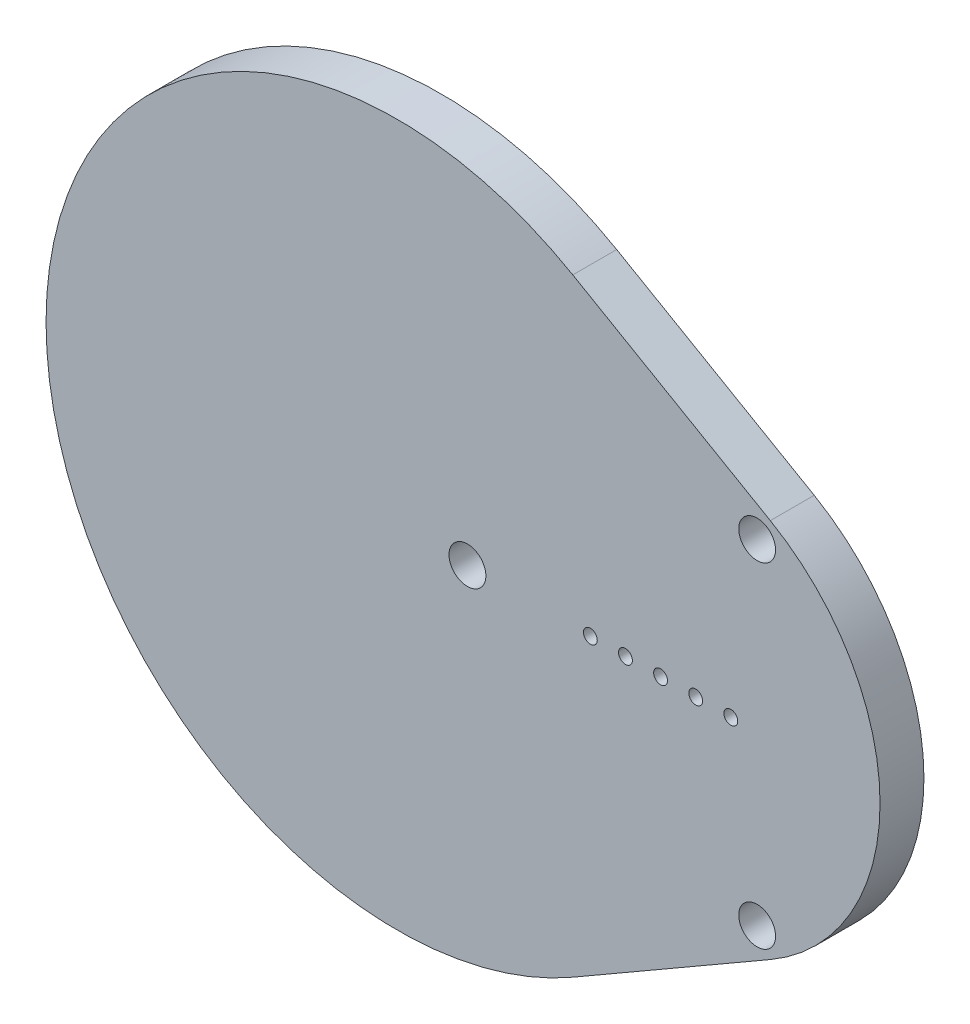
ISO-10303-21;
HEADER;
FILE_DESCRIPTION(('STEP AP214'),'2;1');
FILE_NAME('part.step','',(''),(''),'','','');
FILE_SCHEMA(('AUTOMOTIVE_DESIGN { 1 0 10303 214 1 1 1 1 }'));
ENDSEC;
DATA;
#1=APPLICATION_CONTEXT('core data for automotive mechanical design processes');
#2=APPLICATION_PROTOCOL_DEFINITION('international standard','automotive_design',2000,#1);
#3=PRODUCT_CONTEXT('',#1,'mechanical');
#4=PRODUCT('Part','Part','',(#3));
#5=PRODUCT_RELATED_PRODUCT_CATEGORY('part','',(#4));
#6=PRODUCT_DEFINITION_FORMATION('','',#4);
#7=PRODUCT_DEFINITION_CONTEXT('part definition',#1,'design');
#8=PRODUCT_DEFINITION('design','',#6,#7);
#9=PRODUCT_DEFINITION_SHAPE('','',#8);
#10=(LENGTH_UNIT() NAMED_UNIT(*) SI_UNIT(.MILLI.,.METRE.));
#11=(NAMED_UNIT(*) PLANE_ANGLE_UNIT() SI_UNIT($,.RADIAN.));
#12=(NAMED_UNIT(*) SI_UNIT($,.STERADIAN.) SOLID_ANGLE_UNIT());
#13=UNCERTAINTY_MEASURE_WITH_UNIT(LENGTH_MEASURE(1.E-05),#10,'distance_accuracy_value','');
#14=(GEOMETRIC_REPRESENTATION_CONTEXT(3) GLOBAL_UNCERTAINTY_ASSIGNED_CONTEXT((#13)) GLOBAL_UNIT_ASSIGNED_CONTEXT((#10,
#11,#12)) REPRESENTATION_CONTEXT('',''));
#15=CARTESIAN_POINT('',(0.,0.,0.));
#16=DIRECTION('',(0.,0.,1.));
#17=DIRECTION('',(1.,0.,0.));
#18=AXIS2_PLACEMENT_3D('',#15,#16,#17);
#19=CARTESIAN_POINT('',(15.875,27.4963065701559,6.35));
#20=DIRECTION('',(-0.5,-0.866025403784439,0.));
#21=DIRECTION('',(0.866025403784439,-0.5,0.));
#22=AXIS2_PLACEMENT_3D('',#19,#20,#21);
#23=PLANE('',#22);
#24=DIRECTION('',(-0.866025403784439,0.5,0.));
#25=VECTOR('',#24,1.);
#26=CARTESIAN_POINT('',(15.875,27.4963065701559,0.));
#27=LINE('',#26,#25);
#28=CARTESIAN_POINT('',(15.875,27.4963065701559,0.));
#29=VERTEX_POINT('',#28);
#30=CARTESIAN_POINT('',(-12.7,43.9940905122495,0.));
#31=VERTEX_POINT('',#30);
#32=EDGE_CURVE('E290',#29,#31,#27,.T.);
#33=ORIENTED_EDGE('',*,*,#32,.T.);
#34=DIRECTION('',(0.,0.,-1.));
#35=VECTOR('',#34,1.);
#36=CARTESIAN_POINT('',(-12.7,43.9940905122495,6.35));
#37=LINE('',#36,#35);
#38=CARTESIAN_POINT('',(-12.7,43.9940905122495,6.35));
#39=VERTEX_POINT('',#38);
#40=EDGE_CURVE('E235',#39,#31,#37,.T.);
#41=ORIENTED_EDGE('',*,*,#40,.F.);
#42=DIRECTION('',(-0.866025403784439,0.5,0.));
#43=VECTOR('',#42,1.);
#44=CARTESIAN_POINT('',(15.875,27.4963065701559,6.35));
#45=LINE('',#44,#43);
#46=CARTESIAN_POINT('',(15.875,27.4963065701559,6.35));
#47=VERTEX_POINT('',#46);
#48=EDGE_CURVE('E276',#47,#39,#45,.T.);
#49=ORIENTED_EDGE('',*,*,#48,.F.);
#50=DIRECTION('',(0.,0.,-1.));
#51=VECTOR('',#50,1.);
#52=CARTESIAN_POINT('',(15.875,27.4963065701559,6.35));
#53=LINE('',#52,#51);
#54=EDGE_CURVE('E12',#47,#29,#53,.T.);
#55=ORIENTED_EDGE('',*,*,#54,.T.);
#56=EDGE_LOOP('',(#33,#41,#49,#55));
#57=FACE_BOUND('',#56,.T.);
#58=ADVANCED_FACE('F224',(#57),#23,.F.);
#59=CARTESIAN_POINT('',(-38.1,0.,6.35));
#60=DIRECTION('',(0.,0.,-1.));
#61=DIRECTION('',(-1.,0.,0.));
#62=AXIS2_PLACEMENT_3D('',#59,#60,#61);
#63=CYLINDRICAL_SURFACE('',#62,50.8);
#64=CARTESIAN_POINT('',(-38.1,0.,0.));
#65=DIRECTION('',(0.,0.,1.));
#66=DIRECTION('',(1.,0.,0.));
#67=AXIS2_PLACEMENT_3D('',#64,#65,#66);
#68=CIRCLE('',#67,50.8);
#69=CARTESIAN_POINT('',(-12.7,-43.9940905122495,0.));
#70=VERTEX_POINT('',#69);
#71=EDGE_CURVE('E306',#31,#70,#68,.T.);
#72=ORIENTED_EDGE('',*,*,#71,.T.);
#73=DIRECTION('',(0.,0.,-1.));
#74=VECTOR('',#73,1.);
#75=CARTESIAN_POINT('',(-12.7,-43.9940905122495,6.35));
#76=LINE('',#75,#74);
#77=CARTESIAN_POINT('',(-12.7,-43.9940905122495,6.35));
#78=VERTEX_POINT('',#77);
#79=EDGE_CURVE('E262',#78,#70,#76,.T.);
#80=ORIENTED_EDGE('',*,*,#79,.F.);
#81=CARTESIAN_POINT('',(-38.1,0.,6.35));
#82=DIRECTION('',(0.,0.,1.));
#83=DIRECTION('',(1.,0.,0.));
#84=AXIS2_PLACEMENT_3D('',#81,#82,#83);
#85=CIRCLE('',#84,50.8);
#86=EDGE_CURVE('E282',#39,#78,#85,.T.);
#87=ORIENTED_EDGE('',*,*,#86,.F.);
#88=ORIENTED_EDGE('',*,*,#40,.T.);
#89=EDGE_LOOP('',(#72,#80,#87,#88));
#90=FACE_BOUND('',#89,.T.);
#91=ADVANCED_FACE('F295',(#90),#63,.T.);
#92=CARTESIAN_POINT('',(15.875,-27.4963065701559,6.35));
#93=DIRECTION('',(0.5,-0.866025403784439,0.));
#94=DIRECTION('',(0.866025403784439,0.5,0.));
#95=AXIS2_PLACEMENT_3D('',#92,#93,#94);
#96=PLANE('',#95);
#97=DIRECTION('',(-0.866025403784439,-0.5,0.));
#98=VECTOR('',#97,1.);
#99=CARTESIAN_POINT('',(15.875,-27.4963065701559,0.));
#100=LINE('',#99,#98);
#101=CARTESIAN_POINT('',(15.875,-27.4963065701559,0.));
#102=VERTEX_POINT('',#101);
#103=EDGE_CURVE('E286',#102,#70,#100,.T.);
#104=ORIENTED_EDGE('',*,*,#103,.F.);
#105=DIRECTION('',(0.,0.,-1.));
#106=VECTOR('',#105,1.);
#107=CARTESIAN_POINT('',(15.875,-27.4963065701559,6.35));
#108=LINE('',#107,#106);
#109=CARTESIAN_POINT('',(15.875,-27.4963065701559,6.35));
#110=VERTEX_POINT('',#109);
#111=EDGE_CURVE('E246',#110,#102,#108,.T.);
#112=ORIENTED_EDGE('',*,*,#111,.F.);
#113=DIRECTION('',(-0.866025403784439,-0.5,0.));
#114=VECTOR('',#113,1.);
#115=CARTESIAN_POINT('',(15.875,-27.4963065701559,6.35));
#116=LINE('',#115,#114);
#117=EDGE_CURVE('E297',#110,#78,#116,.T.);
#118=ORIENTED_EDGE('',*,*,#117,.T.);
#119=ORIENTED_EDGE('',*,*,#79,.T.);
#120=EDGE_LOOP('',(#104,#112,#118,#119));
#121=FACE_BOUND('',#120,.T.);
#122=ADVANCED_FACE('F379',(#121),#96,.T.);
#123=CARTESIAN_POINT('',(0.,0.,0.));
#124=DIRECTION('',(0.,0.,1.));
#125=DIRECTION('',(1.,0.,0.));
#126=AXIS2_PLACEMENT_3D('',#123,#124,#125);
#127=PLANE('',#126);
#128=ORIENTED_EDGE('',*,*,#32,.F.);
#129=CARTESIAN_POINT('',(0.,0.,0.));
#130=DIRECTION('',(0.,0.,1.));
#131=DIRECTION('',(1.,0.,0.));
#132=AXIS2_PLACEMENT_3D('',#129,#130,#131);
#133=CIRCLE('',#132,31.75);
#134=EDGE_CURVE('E228',#102,#29,#133,.T.);
#135=ORIENTED_EDGE('',*,*,#134,.F.);
#136=ORIENTED_EDGE('',*,*,#103,.T.);
#137=ORIENTED_EDGE('',*,*,#71,.F.);
#138=EDGE_LOOP('',(#128,#135,#136,#137));
#139=FACE_BOUND('',#138,.T.);
#140=CARTESIAN_POINT('',(13.97,24.1967497817372,0.));
#141=DIRECTION('',(0.,0.,1.));
#142=DIRECTION('',(1.,0.,0.));
#143=AXIS2_PLACEMENT_3D('',#140,#141,#142);
#144=CIRCLE('',#143,2.665);
#145=CARTESIAN_POINT('',(16.635,24.1967497817372,0.));
#146=VERTEX_POINT('',#145);
#147=EDGE_CURVE('E364',#146,#146,#144,.T.);
#148=ORIENTED_EDGE('',*,*,#147,.T.);
#149=EDGE_LOOP('',(#148));
#150=FACE_BOUND('',#149,.T.);
#151=CARTESIAN_POINT('',(13.97,-24.1967497817372,0.));
#152=DIRECTION('',(0.,0.,1.));
#153=DIRECTION('',(1.,0.,0.));
#154=AXIS2_PLACEMENT_3D('',#151,#152,#153);
#155=CIRCLE('',#154,2.66500000000001);
#156=CARTESIAN_POINT('',(16.635,-24.1967497817372,0.));
#157=VERTEX_POINT('',#156);
#158=EDGE_CURVE('E357',#157,#157,#155,.T.);
#159=ORIENTED_EDGE('',*,*,#158,.T.);
#160=EDGE_LOOP('',(#159));
#161=FACE_BOUND('',#160,.T.);
#162=CARTESIAN_POINT('',(-27.94,0.,0.));
#163=DIRECTION('',(0.,0.,1.));
#164=DIRECTION('',(1.,0.,0.));
#165=AXIS2_PLACEMENT_3D('',#162,#163,#164);
#166=CIRCLE('',#165,2.665);
#167=CARTESIAN_POINT('',(-25.275,0.,0.));
#168=VERTEX_POINT('',#167);
#169=EDGE_CURVE('E350',#168,#168,#166,.T.);
#170=ORIENTED_EDGE('',*,*,#169,.T.);
#171=EDGE_LOOP('',(#170));
#172=FACE_BOUND('',#171,.T.);
#173=CARTESIAN_POINT('',(-10.16,0.,0.));
#174=DIRECTION('',(0.,0.,1.));
#175=DIRECTION('',(1.,0.,0.));
#176=AXIS2_PLACEMENT_3D('',#173,#174,#175);
#177=CIRCLE('',#176,1.);
#178=CARTESIAN_POINT('',(-9.16,0.,0.));
#179=VERTEX_POINT('',#178);
#180=EDGE_CURVE('E342',#179,#179,#177,.T.);
#181=ORIENTED_EDGE('',*,*,#180,.T.);
#182=EDGE_LOOP('',(#181));
#183=FACE_BOUND('',#182,.T.);
#184=CARTESIAN_POINT('',(0.,0.,0.));
#185=DIRECTION('',(0.,0.,1.));
#186=DIRECTION('',(1.,0.,0.));
#187=AXIS2_PLACEMENT_3D('',#184,#185,#186);
#188=CIRCLE('',#187,1.);
#189=CARTESIAN_POINT('',(1.,0.,0.));
#190=VERTEX_POINT('',#189);
#191=EDGE_CURVE('E334',#190,#190,#188,.T.);
#192=ORIENTED_EDGE('',*,*,#191,.T.);
#193=EDGE_LOOP('',(#192));
#194=FACE_BOUND('',#193,.T.);
#195=CARTESIAN_POINT('',(5.08,0.,0.));
#196=DIRECTION('',(0.,0.,1.));
#197=DIRECTION('',(1.,0.,0.));
#198=AXIS2_PLACEMENT_3D('',#195,#196,#197);
#199=CIRCLE('',#198,1.);
#200=CARTESIAN_POINT('',(6.08,0.,0.));
#201=VERTEX_POINT('',#200);
#202=EDGE_CURVE('E327',#201,#201,#199,.T.);
#203=ORIENTED_EDGE('',*,*,#202,.T.);
#204=EDGE_LOOP('',(#203));
#205=FACE_BOUND('',#204,.T.);
#206=CARTESIAN_POINT('',(10.16,0.,0.));
#207=DIRECTION('',(0.,0.,1.));
#208=DIRECTION('',(1.,0.,0.));
#209=AXIS2_PLACEMENT_3D('',#206,#207,#208);
#210=CIRCLE('',#209,1.);
#211=CARTESIAN_POINT('',(11.16,0.,0.));
#212=VERTEX_POINT('',#211);
#213=EDGE_CURVE('E318',#212,#212,#210,.T.);
#214=ORIENTED_EDGE('',*,*,#213,.T.);
#215=EDGE_LOOP('',(#214));
#216=FACE_BOUND('',#215,.T.);
#217=CARTESIAN_POINT('',(-5.08,0.,0.));
#218=DIRECTION('',(0.,0.,1.));
#219=DIRECTION('',(1.,0.,0.));
#220=AXIS2_PLACEMENT_3D('',#217,#218,#219);
#221=CIRCLE('',#220,1.);
#222=CARTESIAN_POINT('',(-4.08,0.,0.));
#223=VERTEX_POINT('',#222);
#224=EDGE_CURVE('E319',#223,#223,#221,.T.);
#225=ORIENTED_EDGE('',*,*,#224,.T.);
#226=EDGE_LOOP('',(#225));
#227=FACE_BOUND('',#226,.T.);
#228=ADVANCED_FACE('F377',(#139,#150,#161,#172,#183,#194,#205,#216,#227),#127,.F.);
#229=CARTESIAN_POINT('',(0.,0.,6.35));
#230=DIRECTION('',(0.,0.,1.));
#231=DIRECTION('',(1.,0.,0.));
#232=AXIS2_PLACEMENT_3D('',#229,#230,#231);
#233=PLANE('',#232);
#234=ORIENTED_EDGE('',*,*,#117,.F.);
#235=CARTESIAN_POINT('',(0.,0.,6.35));
#236=DIRECTION('',(0.,0.,1.));
#237=DIRECTION('',(1.,0.,0.));
#238=AXIS2_PLACEMENT_3D('',#235,#236,#237);
#239=CIRCLE('',#238,31.75);
#240=EDGE_CURVE('E283',#110,#47,#239,.T.);
#241=ORIENTED_EDGE('',*,*,#240,.T.);
#242=ORIENTED_EDGE('',*,*,#48,.T.);
#243=ORIENTED_EDGE('',*,*,#86,.T.);
#244=EDGE_LOOP('',(#234,#241,#242,#243));
#245=FACE_BOUND('',#244,.T.);
#246=CARTESIAN_POINT('',(10.16,0.,6.35));
#247=DIRECTION('',(0.,0.,1.));
#248=DIRECTION('',(1.,0.,0.));
#249=AXIS2_PLACEMENT_3D('',#246,#247,#248);
#250=CIRCLE('',#249,1.);
#251=CARTESIAN_POINT('',(11.16,0.,6.35));
#252=VERTEX_POINT('',#251);
#253=EDGE_CURVE('E323',#252,#252,#250,.T.);
#254=ORIENTED_EDGE('',*,*,#253,.F.);
#255=EDGE_LOOP('',(#254));
#256=FACE_BOUND('',#255,.T.);
#257=CARTESIAN_POINT('',(0.,0.,6.35));
#258=DIRECTION('',(0.,0.,1.));
#259=DIRECTION('',(1.,0.,0.));
#260=AXIS2_PLACEMENT_3D('',#257,#258,#259);
#261=CIRCLE('',#260,1.);
#262=CARTESIAN_POINT('',(1.,0.,6.35));
#263=VERTEX_POINT('',#262);
#264=EDGE_CURVE('E338',#263,#263,#261,.T.);
#265=ORIENTED_EDGE('',*,*,#264,.F.);
#266=EDGE_LOOP('',(#265));
#267=FACE_BOUND('',#266,.T.);
#268=CARTESIAN_POINT('',(-27.94,0.,6.35));
#269=DIRECTION('',(0.,0.,1.));
#270=DIRECTION('',(1.,0.,0.));
#271=AXIS2_PLACEMENT_3D('',#268,#269,#270);
#272=CIRCLE('',#271,2.665);
#273=CARTESIAN_POINT('',(-25.275,0.,6.35));
#274=VERTEX_POINT('',#273);
#275=EDGE_CURVE('E354',#274,#274,#272,.T.);
#276=ORIENTED_EDGE('',*,*,#275,.F.);
#277=EDGE_LOOP('',(#276));
#278=FACE_BOUND('',#277,.T.);
#279=CARTESIAN_POINT('',(13.97,24.1967497817372,6.35));
#280=DIRECTION('',(0.,0.,1.));
#281=DIRECTION('',(1.,0.,0.));
#282=AXIS2_PLACEMENT_3D('',#279,#280,#281);
#283=CIRCLE('',#282,2.665);
#284=CARTESIAN_POINT('',(16.635,24.1967497817372,6.35));
#285=VERTEX_POINT('',#284);
#286=EDGE_CURVE('E368',#285,#285,#283,.T.);
#287=ORIENTED_EDGE('',*,*,#286,.F.);
#288=EDGE_LOOP('',(#287));
#289=FACE_BOUND('',#288,.T.);
#290=CARTESIAN_POINT('',(13.97,-24.1967497817372,6.35));
#291=DIRECTION('',(0.,0.,1.));
#292=DIRECTION('',(1.,0.,0.));
#293=AXIS2_PLACEMENT_3D('',#290,#291,#292);
#294=CIRCLE('',#293,2.66500000000001);
#295=CARTESIAN_POINT('',(16.635,-24.1967497817372,6.35));
#296=VERTEX_POINT('',#295);
#297=EDGE_CURVE('E360',#296,#296,#294,.T.);
#298=ORIENTED_EDGE('',*,*,#297,.F.);
#299=EDGE_LOOP('',(#298));
#300=FACE_BOUND('',#299,.T.);
#301=CARTESIAN_POINT('',(-10.16,0.,6.35));
#302=DIRECTION('',(0.,0.,1.));
#303=DIRECTION('',(1.,0.,0.));
#304=AXIS2_PLACEMENT_3D('',#301,#302,#303);
#305=CIRCLE('',#304,1.);
#306=CARTESIAN_POINT('',(-9.16,0.,6.35));
#307=VERTEX_POINT('',#306);
#308=EDGE_CURVE('E346',#307,#307,#305,.T.);
#309=ORIENTED_EDGE('',*,*,#308,.F.);
#310=EDGE_LOOP('',(#309));
#311=FACE_BOUND('',#310,.T.);
#312=CARTESIAN_POINT('',(5.08,0.,6.35));
#313=DIRECTION('',(0.,0.,1.));
#314=DIRECTION('',(1.,0.,0.));
#315=AXIS2_PLACEMENT_3D('',#312,#313,#314);
#316=CIRCLE('',#315,1.);
#317=CARTESIAN_POINT('',(6.08,0.,6.35));
#318=VERTEX_POINT('',#317);
#319=EDGE_CURVE('E331',#318,#318,#316,.T.);
#320=ORIENTED_EDGE('',*,*,#319,.F.);
#321=EDGE_LOOP('',(#320));
#322=FACE_BOUND('',#321,.T.);
#323=CARTESIAN_POINT('',(-5.08,0.,6.35));
#324=DIRECTION('',(0.,0.,1.));
#325=DIRECTION('',(1.,0.,0.));
#326=AXIS2_PLACEMENT_3D('',#323,#324,#325);
#327=CIRCLE('',#326,1.);
#328=CARTESIAN_POINT('',(-4.08,0.,6.35));
#329=VERTEX_POINT('',#328);
#330=EDGE_CURVE('E314',#329,#329,#327,.T.);
#331=ORIENTED_EDGE('',*,*,#330,.F.);
#332=EDGE_LOOP('',(#331));
#333=FACE_BOUND('',#332,.T.);
#334=ADVANCED_FACE('F279',(#245,#256,#267,#278,#289,#300,#311,#322,#333),#233,.T.);
#335=CARTESIAN_POINT('',(-5.08,0.,6.35));
#336=DIRECTION('',(0.,0.,-1.));
#337=DIRECTION('',(-1.,0.,0.));
#338=AXIS2_PLACEMENT_3D('',#335,#336,#337);
#339=CYLINDRICAL_SURFACE('',#338,1.);
#340=ORIENTED_EDGE('',*,*,#330,.T.);
#341=EDGE_LOOP('',(#340));
#342=FACE_BOUND('',#341,.T.);
#343=ORIENTED_EDGE('',*,*,#224,.F.);
#344=EDGE_LOOP('',(#343));
#345=FACE_BOUND('',#344,.T.);
#346=ADVANCED_FACE('F393',(#342,#345),#339,.F.);
#347=CARTESIAN_POINT('',(10.16,0.,6.35));
#348=DIRECTION('',(0.,0.,-1.));
#349=DIRECTION('',(-1.,0.,0.));
#350=AXIS2_PLACEMENT_3D('',#347,#348,#349);
#351=CYLINDRICAL_SURFACE('',#350,1.);
#352=ORIENTED_EDGE('',*,*,#253,.T.);
#353=EDGE_LOOP('',(#352));
#354=FACE_BOUND('',#353,.T.);
#355=ORIENTED_EDGE('',*,*,#213,.F.);
#356=EDGE_LOOP('',(#355));
#357=FACE_BOUND('',#356,.T.);
#358=ADVANCED_FACE('F396',(#354,#357),#351,.F.);
#359=CARTESIAN_POINT('',(5.08,0.,6.35));
#360=DIRECTION('',(0.,0.,-1.));
#361=DIRECTION('',(-1.,0.,0.));
#362=AXIS2_PLACEMENT_3D('',#359,#360,#361);
#363=CYLINDRICAL_SURFACE('',#362,1.);
#364=ORIENTED_EDGE('',*,*,#319,.T.);
#365=EDGE_LOOP('',(#364));
#366=FACE_BOUND('',#365,.T.);
#367=ORIENTED_EDGE('',*,*,#202,.F.);
#368=EDGE_LOOP('',(#367));
#369=FACE_BOUND('',#368,.T.);
#370=ADVANCED_FACE('F400',(#366,#369),#363,.F.);
#371=CARTESIAN_POINT('',(0.,0.,6.35));
#372=DIRECTION('',(0.,0.,-1.));
#373=DIRECTION('',(-1.,0.,0.));
#374=AXIS2_PLACEMENT_3D('',#371,#372,#373);
#375=CYLINDRICAL_SURFACE('',#374,1.);
#376=ORIENTED_EDGE('',*,*,#264,.T.);
#377=EDGE_LOOP('',(#376));
#378=FACE_BOUND('',#377,.T.);
#379=ORIENTED_EDGE('',*,*,#191,.F.);
#380=EDGE_LOOP('',(#379));
#381=FACE_BOUND('',#380,.T.);
#382=ADVANCED_FACE('F404',(#378,#381),#375,.F.);
#383=CARTESIAN_POINT('',(-10.16,0.,6.35));
#384=DIRECTION('',(0.,0.,-1.));
#385=DIRECTION('',(-1.,0.,0.));
#386=AXIS2_PLACEMENT_3D('',#383,#384,#385);
#387=CYLINDRICAL_SURFACE('',#386,1.);
#388=ORIENTED_EDGE('',*,*,#308,.T.);
#389=EDGE_LOOP('',(#388));
#390=FACE_BOUND('',#389,.T.);
#391=ORIENTED_EDGE('',*,*,#180,.F.);
#392=EDGE_LOOP('',(#391));
#393=FACE_BOUND('',#392,.T.);
#394=ADVANCED_FACE('F408',(#390,#393),#387,.F.);
#395=CARTESIAN_POINT('',(-27.94,0.,6.35));
#396=DIRECTION('',(0.,0.,-1.));
#397=DIRECTION('',(-1.,0.,0.));
#398=AXIS2_PLACEMENT_3D('',#395,#396,#397);
#399=CYLINDRICAL_SURFACE('',#398,2.665);
#400=ORIENTED_EDGE('',*,*,#275,.T.);
#401=EDGE_LOOP('',(#400));
#402=FACE_BOUND('',#401,.T.);
#403=ORIENTED_EDGE('',*,*,#169,.F.);
#404=EDGE_LOOP('',(#403));
#405=FACE_BOUND('',#404,.T.);
#406=ADVANCED_FACE('F412',(#402,#405),#399,.F.);
#407=CARTESIAN_POINT('',(13.97,-24.1967497817372,6.35));
#408=DIRECTION('',(0.,0.,-1.));
#409=DIRECTION('',(-1.,0.,0.));
#410=AXIS2_PLACEMENT_3D('',#407,#408,#409);
#411=CYLINDRICAL_SURFACE('',#410,2.66500000000001);
#412=ORIENTED_EDGE('',*,*,#297,.T.);
#413=EDGE_LOOP('',(#412));
#414=FACE_BOUND('',#413,.T.);
#415=ORIENTED_EDGE('',*,*,#158,.F.);
#416=EDGE_LOOP('',(#415));
#417=FACE_BOUND('',#416,.T.);
#418=ADVANCED_FACE('F416',(#414,#417),#411,.F.);
#419=CARTESIAN_POINT('',(13.97,24.1967497817372,6.35));
#420=DIRECTION('',(0.,0.,-1.));
#421=DIRECTION('',(-1.,0.,0.));
#422=AXIS2_PLACEMENT_3D('',#419,#420,#421);
#423=CYLINDRICAL_SURFACE('',#422,2.665);
#424=ORIENTED_EDGE('',*,*,#286,.T.);
#425=EDGE_LOOP('',(#424));
#426=FACE_BOUND('',#425,.T.);
#427=ORIENTED_EDGE('',*,*,#147,.F.);
#428=EDGE_LOOP('',(#427));
#429=FACE_BOUND('',#428,.T.);
#430=ADVANCED_FACE('F419',(#426,#429),#423,.F.);
#431=CARTESIAN_POINT('',(0.,0.,6.35));
#432=DIRECTION('',(0.,0.,-1.));
#433=DIRECTION('',(-1.,0.,0.));
#434=AXIS2_PLACEMENT_3D('',#431,#432,#433);
#435=CYLINDRICAL_SURFACE('',#434,31.75);
#436=ORIENTED_EDGE('',*,*,#134,.T.);
#437=ORIENTED_EDGE('',*,*,#54,.F.);
#438=ORIENTED_EDGE('',*,*,#240,.F.);
#439=ORIENTED_EDGE('',*,*,#111,.T.);
#440=EDGE_LOOP('',(#436,#437,#438,#439));
#441=FACE_BOUND('',#440,.T.);
#442=ADVANCED_FACE('F226',(#441),#435,.T.);
#443=CLOSED_SHELL('',(#58,#91,#122,#228,#334,#346,#358,#370,#382,#394,#406,#418,#430,#442));
#444=MANIFOLD_SOLID_BREP('B2',#443);
#445=ADVANCED_BREP_SHAPE_REPRESENTATION('',(#18,#444),#14);
#446=SHAPE_DEFINITION_REPRESENTATION(#9,#445);
ENDSEC;
END-ISO-10303-21;
